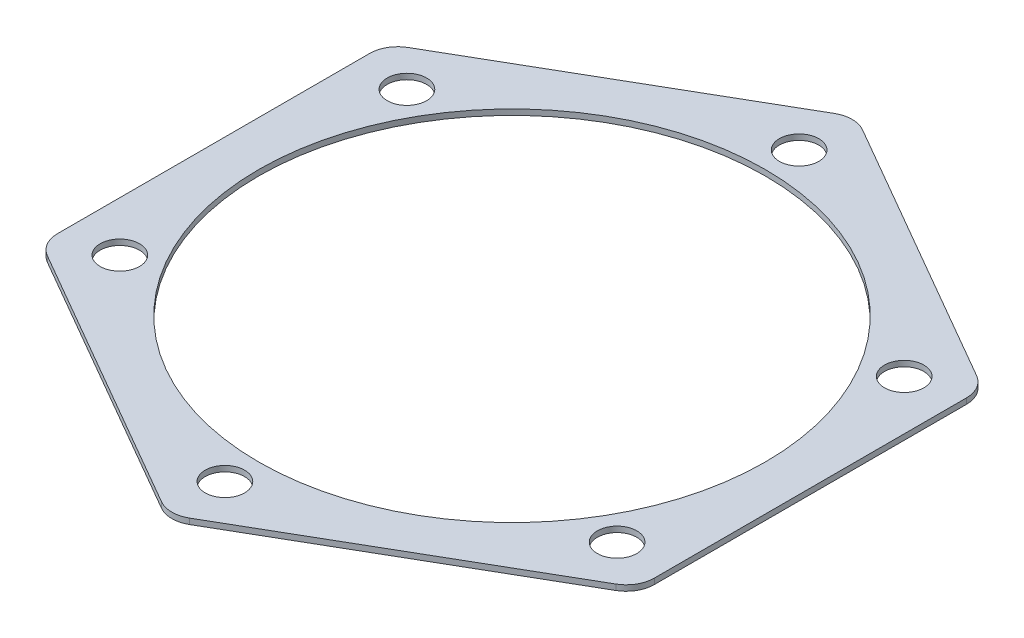
ISO-10303-21;
HEADER;
FILE_DESCRIPTION(('STEP AP214'),'2;1');
FILE_NAME('part.step','',(''),(''),'','','');
FILE_SCHEMA(('AUTOMOTIVE_DESIGN { 1 0 10303 214 1 1 1 1 }'));
ENDSEC;
DATA;
#1=APPLICATION_CONTEXT('core data for automotive mechanical design processes');
#2=APPLICATION_PROTOCOL_DEFINITION('international standard','automotive_design',2000,#1);
#3=PRODUCT_CONTEXT('',#1,'mechanical');
#4=PRODUCT('Part','Part','',(#3));
#5=PRODUCT_RELATED_PRODUCT_CATEGORY('part','',(#4));
#6=PRODUCT_DEFINITION_FORMATION('','',#4);
#7=PRODUCT_DEFINITION_CONTEXT('part definition',#1,'design');
#8=PRODUCT_DEFINITION('design','',#6,#7);
#9=PRODUCT_DEFINITION_SHAPE('','',#8);
#10=(LENGTH_UNIT() NAMED_UNIT(*) SI_UNIT(.MILLI.,.METRE.));
#11=(NAMED_UNIT(*) PLANE_ANGLE_UNIT() SI_UNIT($,.RADIAN.));
#12=(NAMED_UNIT(*) SI_UNIT($,.STERADIAN.) SOLID_ANGLE_UNIT());
#13=UNCERTAINTY_MEASURE_WITH_UNIT(LENGTH_MEASURE(1.E-05),#10,'distance_accuracy_value','');
#14=(GEOMETRIC_REPRESENTATION_CONTEXT(3) GLOBAL_UNCERTAINTY_ASSIGNED_CONTEXT((#13)) GLOBAL_UNIT_ASSIGNED_CONTEXT((#10,
#11,#12)) REPRESENTATION_CONTEXT('',''));
#15=CARTESIAN_POINT('',(0.,0.,0.));
#16=DIRECTION('',(0.,0.,1.));
#17=DIRECTION('',(1.,0.,0.));
#18=AXIS2_PLACEMENT_3D('',#15,#16,#17);
#19=CARTESIAN_POINT('',(3.5120950745773E-13,1.,55.4256258422041));
#20=DIRECTION('',(0.,1.,0.));
#21=DIRECTION('',(0.,0.,1.));
#22=AXIS2_PLACEMENT_3D('',#19,#20,#21);
#23=PLANE('',#22);
#24=CARTESIAN_POINT('',(-44.1672955930031,1.,25.5000000000019));
#25=DIRECTION('',(0.,1.,0.));
#26=DIRECTION('',(0.,0.,1.));
#27=AXIS2_PLACEMENT_3D('',#24,#25,#26);
#28=CIRCLE('',#27,3.50000000000413);
#29=CARTESIAN_POINT('',(-44.1672955930031,1.,29.000000000006));
#30=VERTEX_POINT('',#29);
#31=EDGE_CURVE('E350',#30,#30,#28,.T.);
#32=ORIENTED_EDGE('',*,*,#31,.F.);
#33=EDGE_LOOP('',(#32));
#34=FACE_BOUND('',#33,.T.);
#35=CARTESIAN_POINT('',(44.1672955930096,1.,25.4999999999981));
#36=DIRECTION('',(0.,1.,0.));
#37=DIRECTION('',(0.,0.,1.));
#38=AXIS2_PLACEMENT_3D('',#35,#36,#37);
#39=CIRCLE('',#38,3.50000000000279);
#40=CARTESIAN_POINT('',(44.1672955930096,1.,29.0000000000009));
#41=VERTEX_POINT('',#40);
#42=EDGE_CURVE('E366',#41,#41,#39,.T.);
#43=ORIENTED_EDGE('',*,*,#42,.F.);
#44=EDGE_LOOP('',(#43));
#45=FACE_BOUND('',#44,.T.);
#46=CARTESIAN_POINT('',(0.,1.,-51.));
#47=DIRECTION('',(0.,1.,0.));
#48=DIRECTION('',(0.,0.,1.));
#49=AXIS2_PLACEMENT_3D('',#46,#47,#48);
#50=CIRCLE('',#49,3.5);
#51=CARTESIAN_POINT('',(0.,1.,-47.5));
#52=VERTEX_POINT('',#51);
#53=EDGE_CURVE('E382',#52,#52,#50,.T.);
#54=ORIENTED_EDGE('',*,*,#53,.F.);
#55=EDGE_LOOP('',(#54));
#56=FACE_BOUND('',#55,.T.);
#57=CARTESIAN_POINT('',(3.5120950745773E-13,1.,55.4256258422041));
#58=DIRECTION('',(0.,1.,0.));
#59=DIRECTION('',(0.,0.,1.));
#60=AXIS2_PLACEMENT_3D('',#57,#58,#59);
#61=CIRCLE('',#60,5.);
#62=CARTESIAN_POINT('',(-2.49999999999964,1.,59.7557528611263));
#63=VERTEX_POINT('',#62);
#64=CARTESIAN_POINT('',(2.5000000000004,1.,59.7557528611262));
#65=VERTEX_POINT('',#64);
#66=EDGE_CURVE('E206',#63,#65,#61,.T.);
#67=ORIENTED_EDGE('',*,*,#66,.T.);
#68=DIRECTION('',(0.866025403784435,0.,-0.500000000000006));
#69=VECTOR('',#68,1.);
#70=CARTESIAN_POINT('',(2.5000000000004,1.,59.7557528611262));
#71=LINE('',#70,#69);
#72=CARTESIAN_POINT('',(50.5000000000002,1.,32.0429399400239));
#73=VERTEX_POINT('',#72);
#74=EDGE_CURVE('E118',#65,#73,#71,.T.);
#75=ORIENTED_EDGE('',*,*,#74,.T.);
#76=CARTESIAN_POINT('',(48.0000000000002,1.,27.7128129211017));
#77=DIRECTION('',(0.,1.,0.));
#78=DIRECTION('',(0.,0.,-1.));
#79=AXIS2_PLACEMENT_3D('',#76,#77,#78);
#80=CIRCLE('',#79,5.);
#81=CARTESIAN_POINT('',(53.0000000000002,1.,27.7128129211017));
#82=VERTEX_POINT('',#81);
#83=EDGE_CURVE('E243',#73,#82,#80,.T.);
#84=ORIENTED_EDGE('',*,*,#83,.T.);
#85=DIRECTION('',(0.,0.,-1.));
#86=VECTOR('',#85,1.);
#87=CARTESIAN_POINT('',(53.0000000000002,1.,27.7128129211017));
#88=LINE('',#87,#86);
#89=CARTESIAN_POINT('',(52.9999999999998,1.,-27.7128129211024));
#90=VERTEX_POINT('',#89);
#91=EDGE_CURVE('E263',#82,#90,#88,.T.);
#92=ORIENTED_EDGE('',*,*,#91,.T.);
#93=CARTESIAN_POINT('',(47.9999999999998,1.,-27.7128129211024));
#94=DIRECTION('',(0.,1.,0.));
#95=DIRECTION('',(0.,0.,1.));
#96=AXIS2_PLACEMENT_3D('',#93,#94,#95);
#97=CIRCLE('',#96,5.);
#98=CARTESIAN_POINT('',(50.4999999999998,1.,-32.0429399400246));
#99=VERTEX_POINT('',#98);
#100=EDGE_CURVE('E259',#90,#99,#97,.T.);
#101=ORIENTED_EDGE('',*,*,#100,.T.);
#102=DIRECTION('',(-0.866025403784442,0.,-0.499999999999994));
#103=VECTOR('',#102,1.);
#104=CARTESIAN_POINT('',(50.4999999999998,1.,-32.0429399400246));
#105=LINE('',#104,#103);
#106=CARTESIAN_POINT('',(2.49999999999965,1.,-59.7557528611263));
#107=VERTEX_POINT('',#106);
#108=EDGE_CURVE('E262',#99,#107,#105,.T.);
#109=ORIENTED_EDGE('',*,*,#108,.T.);
#110=CARTESIAN_POINT('',(-3.43559670313786E-13,1.,-55.4256258422041));
#111=DIRECTION('',(0.,1.,0.));
#112=DIRECTION('',(0.,0.,1.));
#113=AXIS2_PLACEMENT_3D('',#110,#111,#112);
#114=CIRCLE('',#113,5.);
#115=CARTESIAN_POINT('',(-2.50000000000039,1.,-59.7557528611263));
#116=VERTEX_POINT('',#115);
#117=EDGE_CURVE('E267',#107,#116,#114,.T.);
#118=ORIENTED_EDGE('',*,*,#117,.T.);
#119=DIRECTION('',(-0.866025403784435,0.,0.500000000000006));
#120=VECTOR('',#119,1.);
#121=CARTESIAN_POINT('',(-2.50000000000039,1.,-59.7557528611263));
#122=LINE('',#121,#120);
#123=CARTESIAN_POINT('',(-50.5000000000002,1.,-32.0429399400239));
#124=VERTEX_POINT('',#123);
#125=EDGE_CURVE('E274',#116,#124,#122,.T.);
#126=ORIENTED_EDGE('',*,*,#125,.T.);
#127=CARTESIAN_POINT('',(-48.0000000000002,1.,-27.7128129211017));
#128=DIRECTION('',(0.,1.,0.));
#129=DIRECTION('',(0.,0.,1.));
#130=AXIS2_PLACEMENT_3D('',#127,#128,#129);
#131=CIRCLE('',#130,5.);
#132=CARTESIAN_POINT('',(-53.0000000000002,1.,-27.7128129211017));
#133=VERTEX_POINT('',#132);
#134=EDGE_CURVE('E149',#124,#133,#131,.T.);
#135=ORIENTED_EDGE('',*,*,#134,.T.);
#136=DIRECTION('',(0.,0.,1.));
#137=VECTOR('',#136,1.);
#138=CARTESIAN_POINT('',(-53.0000000000002,1.,-27.7128129211017));
#139=LINE('',#138,#137);
#140=CARTESIAN_POINT('',(-52.9999999999998,1.,27.7128129211024));
#141=VERTEX_POINT('',#140);
#142=EDGE_CURVE('E143',#133,#141,#139,.T.);
#143=ORIENTED_EDGE('',*,*,#142,.T.);
#144=CARTESIAN_POINT('',(-47.9999999999998,1.,27.7128129211024));
#145=DIRECTION('',(0.,1.,0.));
#146=DIRECTION('',(0.,0.,1.));
#147=AXIS2_PLACEMENT_3D('',#144,#145,#146);
#148=CIRCLE('',#147,5.);
#149=CARTESIAN_POINT('',(-50.4999999999998,1.,32.0429399400246));
#150=VERTEX_POINT('',#149);
#151=EDGE_CURVE('E147',#141,#150,#148,.T.);
#152=ORIENTED_EDGE('',*,*,#151,.T.);
#153=DIRECTION('',(0.866025403784442,0.,0.499999999999994));
#154=VECTOR('',#153,1.);
#155=CARTESIAN_POINT('',(-50.4999999999998,1.,32.0429399400246));
#156=LINE('',#155,#154);
#157=EDGE_CURVE('E63',#150,#63,#156,.T.);
#158=ORIENTED_EDGE('',*,*,#157,.T.);
#159=EDGE_LOOP('',(#67,#75,#84,#92,#101,#109,#118,#126,#135,#143,#152,#158));
#160=FACE_BOUND('',#159,.T.);
#161=CARTESIAN_POINT('',(0.,1.,0.));
#162=DIRECTION('',(0.,1.,0.));
#163=DIRECTION('',(0.,0.,1.));
#164=AXIS2_PLACEMENT_3D('',#161,#162,#163);
#165=CIRCLE('',#164,45.);
#166=CARTESIAN_POINT('',(0.,1.,45.));
#167=VERTEX_POINT('',#166);
#168=EDGE_CURVE('E176',#167,#167,#165,.T.);
#169=ORIENTED_EDGE('',*,*,#168,.F.);
#170=EDGE_LOOP('',(#169));
#171=FACE_BOUND('',#170,.T.);
#172=CARTESIAN_POINT('',(44.1672955930074,1.,-25.5000000000019));
#173=DIRECTION('',(0.,1.,0.));
#174=DIRECTION('',(0.,0.,1.));
#175=AXIS2_PLACEMENT_3D('',#172,#173,#174);
#176=CIRCLE('',#175,3.50000000000063);
#177=CARTESIAN_POINT('',(44.1672955930074,1.,-22.0000000000013));
#178=VERTEX_POINT('',#177);
#179=EDGE_CURVE('E374',#178,#178,#176,.T.);
#180=ORIENTED_EDGE('',*,*,#179,.F.);
#181=EDGE_LOOP('',(#180));
#182=FACE_BOUND('',#181,.T.);
#183=CARTESIAN_POINT('',(4.32978444682486E-12,1.,51.));
#184=DIRECTION('',(0.,1.,0.));
#185=DIRECTION('',(0.,0.,1.));
#186=AXIS2_PLACEMENT_3D('',#183,#184,#185);
#187=CIRCLE('',#186,3.50000000000448);
#188=CARTESIAN_POINT('',(4.32978444682486E-12,1.,54.5000000000045));
#189=VERTEX_POINT('',#188);
#190=EDGE_CURVE('E358',#189,#189,#187,.T.);
#191=ORIENTED_EDGE('',*,*,#190,.F.);
#192=EDGE_LOOP('',(#191));
#193=FACE_BOUND('',#192,.T.);
#194=CARTESIAN_POINT('',(-44.1672955930053,1.,-25.4999999999981));
#195=DIRECTION('',(0.,1.,0.));
#196=DIRECTION('',(0.,0.,1.));
#197=AXIS2_PLACEMENT_3D('',#194,#195,#196);
#198=CIRCLE('',#197,3.50000000000219);
#199=CARTESIAN_POINT('',(-44.1672955930053,1.,-21.9999999999959));
#200=VERTEX_POINT('',#199);
#201=EDGE_CURVE('E339',#200,#200,#198,.T.);
#202=ORIENTED_EDGE('',*,*,#201,.F.);
#203=EDGE_LOOP('',(#202));
#204=FACE_BOUND('',#203,.T.);
#205=ADVANCED_FACE('F45',(#34,#45,#56,#160,#171,#182,#193,#204),#23,.T.);
#206=CARTESIAN_POINT('',(3.5120950745773E-13,0.,55.4256258422041));
#207=DIRECTION('',(0.,1.,0.));
#208=DIRECTION('',(0.,0.,1.));
#209=AXIS2_PLACEMENT_3D('',#206,#207,#208);
#210=PLANE('',#209);
#211=CARTESIAN_POINT('',(3.5120950745773E-13,0.,55.4256258422041));
#212=DIRECTION('',(0.,1.,0.));
#213=DIRECTION('',(0.,0.,1.));
#214=AXIS2_PLACEMENT_3D('',#211,#212,#213);
#215=CIRCLE('',#214,5.);
#216=CARTESIAN_POINT('',(-2.49999999999964,0.,59.7557528611263));
#217=VERTEX_POINT('',#216);
#218=CARTESIAN_POINT('',(2.5000000000004,0.,59.7557528611262));
#219=VERTEX_POINT('',#218);
#220=EDGE_CURVE('E171',#217,#219,#215,.T.);
#221=ORIENTED_EDGE('',*,*,#220,.F.);
#222=DIRECTION('',(0.866025403784442,0.,0.499999999999994));
#223=VECTOR('',#222,1.);
#224=CARTESIAN_POINT('',(-50.4999999999998,0.,32.0429399400246));
#225=LINE('',#224,#223);
#226=CARTESIAN_POINT('',(-50.4999999999998,0.,32.0429399400246));
#227=VERTEX_POINT('',#226);
#228=EDGE_CURVE('E110',#227,#217,#225,.T.);
#229=ORIENTED_EDGE('',*,*,#228,.F.);
#230=CARTESIAN_POINT('',(-47.9999999999998,0.,27.7128129211024));
#231=DIRECTION('',(0.,1.,0.));
#232=DIRECTION('',(0.,0.,1.));
#233=AXIS2_PLACEMENT_3D('',#230,#231,#232);
#234=CIRCLE('',#233,5.);
#235=CARTESIAN_POINT('',(-52.9999999999998,0.,27.7128129211024));
#236=VERTEX_POINT('',#235);
#237=EDGE_CURVE('E104',#236,#227,#234,.T.);
#238=ORIENTED_EDGE('',*,*,#237,.F.);
#239=DIRECTION('',(0.,0.,1.));
#240=VECTOR('',#239,1.);
#241=CARTESIAN_POINT('',(-53.0000000000002,0.,-27.7128129211017));
#242=LINE('',#241,#240);
#243=CARTESIAN_POINT('',(-53.0000000000002,0.,-27.7128129211017));
#244=VERTEX_POINT('',#243);
#245=EDGE_CURVE('E158',#244,#236,#242,.T.);
#246=ORIENTED_EDGE('',*,*,#245,.F.);
#247=CARTESIAN_POINT('',(-48.0000000000002,0.,-27.7128129211017));
#248=DIRECTION('',(0.,1.,0.));
#249=DIRECTION('',(0.,0.,1.));
#250=AXIS2_PLACEMENT_3D('',#247,#248,#249);
#251=CIRCLE('',#250,5.);
#252=CARTESIAN_POINT('',(-50.5000000000002,0.,-32.0429399400239));
#253=VERTEX_POINT('',#252);
#254=EDGE_CURVE('E197',#253,#244,#251,.T.);
#255=ORIENTED_EDGE('',*,*,#254,.F.);
#256=DIRECTION('',(-0.866025403784435,0.,0.500000000000006));
#257=VECTOR('',#256,1.);
#258=CARTESIAN_POINT('',(-2.50000000000039,0.,-59.7557528611263));
#259=LINE('',#258,#257);
#260=CARTESIAN_POINT('',(-2.50000000000039,0.,-59.7557528611263));
#261=VERTEX_POINT('',#260);
#262=EDGE_CURVE('E194',#261,#253,#259,.T.);
#263=ORIENTED_EDGE('',*,*,#262,.F.);
#264=CARTESIAN_POINT('',(-3.43559670313786E-13,0.,-55.4256258422041));
#265=DIRECTION('',(0.,1.,0.));
#266=DIRECTION('',(0.,0.,1.));
#267=AXIS2_PLACEMENT_3D('',#264,#265,#266);
#268=CIRCLE('',#267,5.);
#269=CARTESIAN_POINT('',(2.49999999999965,0.,-59.7557528611263));
#270=VERTEX_POINT('',#269);
#271=EDGE_CURVE('E191',#270,#261,#268,.T.);
#272=ORIENTED_EDGE('',*,*,#271,.F.);
#273=DIRECTION('',(-0.866025403784442,0.,-0.499999999999994));
#274=VECTOR('',#273,1.);
#275=CARTESIAN_POINT('',(50.4999999999998,0.,-32.0429399400246));
#276=LINE('',#275,#274);
#277=CARTESIAN_POINT('',(50.4999999999998,0.,-32.0429399400246));
#278=VERTEX_POINT('',#277);
#279=EDGE_CURVE('E188',#278,#270,#276,.T.);
#280=ORIENTED_EDGE('',*,*,#279,.F.);
#281=CARTESIAN_POINT('',(47.9999999999998,0.,-27.7128129211024));
#282=DIRECTION('',(0.,1.,0.));
#283=DIRECTION('',(0.,0.,1.));
#284=AXIS2_PLACEMENT_3D('',#281,#282,#283);
#285=CIRCLE('',#284,5.);
#286=CARTESIAN_POINT('',(52.9999999999998,0.,-27.7128129211024));
#287=VERTEX_POINT('',#286);
#288=EDGE_CURVE('E185',#287,#278,#285,.T.);
#289=ORIENTED_EDGE('',*,*,#288,.F.);
#290=DIRECTION('',(0.,0.,-1.));
#291=VECTOR('',#290,1.);
#292=CARTESIAN_POINT('',(53.0000000000002,0.,27.7128129211017));
#293=LINE('',#292,#291);
#294=CARTESIAN_POINT('',(53.0000000000002,0.,27.7128129211017));
#295=VERTEX_POINT('',#294);
#296=EDGE_CURVE('E182',#295,#287,#293,.T.);
#297=ORIENTED_EDGE('',*,*,#296,.F.);
#298=CARTESIAN_POINT('',(48.0000000000002,0.,27.7128129211017));
#299=DIRECTION('',(0.,1.,0.));
#300=DIRECTION('',(0.,0.,-1.));
#301=AXIS2_PLACEMENT_3D('',#298,#299,#300);
#302=CIRCLE('',#301,5.);
#303=CARTESIAN_POINT('',(50.5000000000002,0.,32.0429399400239));
#304=VERTEX_POINT('',#303);
#305=EDGE_CURVE('E179',#304,#295,#302,.T.);
#306=ORIENTED_EDGE('',*,*,#305,.F.);
#307=DIRECTION('',(0.866025403784435,0.,-0.500000000000006));
#308=VECTOR('',#307,1.);
#309=CARTESIAN_POINT('',(2.5000000000004,0.,59.7557528611262));
#310=LINE('',#309,#308);
#311=EDGE_CURVE('E175',#219,#304,#310,.T.);
#312=ORIENTED_EDGE('',*,*,#311,.F.);
#313=EDGE_LOOP('',(#221,#229,#238,#246,#255,#263,#272,#280,#289,#297,#306,#312));
#314=FACE_BOUND('',#313,.T.);
#315=CARTESIAN_POINT('',(0.,0.,0.));
#316=DIRECTION('',(0.,1.,0.));
#317=DIRECTION('',(0.,0.,1.));
#318=AXIS2_PLACEMENT_3D('',#315,#316,#317);
#319=CIRCLE('',#318,45.);
#320=CARTESIAN_POINT('',(0.,0.,45.));
#321=VERTEX_POINT('',#320);
#322=EDGE_CURVE('E386',#321,#321,#319,.T.);
#323=ORIENTED_EDGE('',*,*,#322,.T.);
#324=EDGE_LOOP('',(#323));
#325=FACE_BOUND('',#324,.T.);
#326=CARTESIAN_POINT('',(0.,0.,-51.));
#327=DIRECTION('',(0.,1.,0.));
#328=DIRECTION('',(0.,0.,1.));
#329=AXIS2_PLACEMENT_3D('',#326,#327,#328);
#330=CIRCLE('',#329,3.5);
#331=CARTESIAN_POINT('',(0.,0.,-47.5));
#332=VERTEX_POINT('',#331);
#333=EDGE_CURVE('E378',#332,#332,#330,.T.);
#334=ORIENTED_EDGE('',*,*,#333,.T.);
#335=EDGE_LOOP('',(#334));
#336=FACE_BOUND('',#335,.T.);
#337=CARTESIAN_POINT('',(44.1672955930074,0.,-25.5000000000019));
#338=DIRECTION('',(0.,1.,0.));
#339=DIRECTION('',(0.,0.,1.));
#340=AXIS2_PLACEMENT_3D('',#337,#338,#339);
#341=CIRCLE('',#340,3.50000000000063);
#342=CARTESIAN_POINT('',(44.1672955930074,0.,-22.0000000000013));
#343=VERTEX_POINT('',#342);
#344=EDGE_CURVE('E370',#343,#343,#341,.T.);
#345=ORIENTED_EDGE('',*,*,#344,.T.);
#346=EDGE_LOOP('',(#345));
#347=FACE_BOUND('',#346,.T.);
#348=CARTESIAN_POINT('',(44.1672955930096,0.,25.4999999999981));
#349=DIRECTION('',(0.,1.,0.));
#350=DIRECTION('',(0.,0.,1.));
#351=AXIS2_PLACEMENT_3D('',#348,#349,#350);
#352=CIRCLE('',#351,3.50000000000279);
#353=CARTESIAN_POINT('',(44.1672955930096,0.,29.0000000000009));
#354=VERTEX_POINT('',#353);
#355=EDGE_CURVE('E362',#354,#354,#352,.T.);
#356=ORIENTED_EDGE('',*,*,#355,.T.);
#357=EDGE_LOOP('',(#356));
#358=FACE_BOUND('',#357,.T.);
#359=CARTESIAN_POINT('',(4.32978444682486E-12,0.,51.));
#360=DIRECTION('',(0.,1.,0.));
#361=DIRECTION('',(0.,0.,1.));
#362=AXIS2_PLACEMENT_3D('',#359,#360,#361);
#363=CIRCLE('',#362,3.50000000000448);
#364=CARTESIAN_POINT('',(4.32978444682486E-12,0.,54.5000000000045));
#365=VERTEX_POINT('',#364);
#366=EDGE_CURVE('E354',#365,#365,#363,.T.);
#367=ORIENTED_EDGE('',*,*,#366,.T.);
#368=EDGE_LOOP('',(#367));
#369=FACE_BOUND('',#368,.T.);
#370=CARTESIAN_POINT('',(-44.1672955930031,0.,25.5000000000019));
#371=DIRECTION('',(0.,1.,0.));
#372=DIRECTION('',(0.,0.,1.));
#373=AXIS2_PLACEMENT_3D('',#370,#371,#372);
#374=CIRCLE('',#373,3.50000000000413);
#375=CARTESIAN_POINT('',(-44.1672955930031,0.,29.000000000006));
#376=VERTEX_POINT('',#375);
#377=EDGE_CURVE('E347',#376,#376,#374,.T.);
#378=ORIENTED_EDGE('',*,*,#377,.T.);
#379=EDGE_LOOP('',(#378));
#380=FACE_BOUND('',#379,.T.);
#381=CARTESIAN_POINT('',(-44.1672955930053,0.,-25.4999999999981));
#382=DIRECTION('',(0.,1.,0.));
#383=DIRECTION('',(0.,0.,1.));
#384=AXIS2_PLACEMENT_3D('',#381,#382,#383);
#385=CIRCLE('',#384,3.50000000000219);
#386=CARTESIAN_POINT('',(-44.1672955930053,0.,-21.9999999999959));
#387=VERTEX_POINT('',#386);
#388=EDGE_CURVE('E342',#387,#387,#385,.T.);
#389=ORIENTED_EDGE('',*,*,#388,.T.);
#390=EDGE_LOOP('',(#389));
#391=FACE_BOUND('',#390,.T.);
#392=ADVANCED_FACE('F247',(#314,#325,#336,#347,#358,#369,#380,#391),#210,.F.);
#393=CARTESIAN_POINT('',(3.5120950745773E-13,1.,55.4256258422041));
#394=DIRECTION('',(0.,-1.,0.));
#395=DIRECTION('',(0.,0.,-1.));
#396=AXIS2_PLACEMENT_3D('',#393,#394,#395);
#397=CYLINDRICAL_SURFACE('',#396,5.);
#398=ORIENTED_EDGE('',*,*,#220,.T.);
#399=DIRECTION('',(0.,-1.,0.));
#400=VECTOR('',#399,1.);
#401=CARTESIAN_POINT('',(2.5000000000004,1.,59.7557528611262));
#402=LINE('',#401,#400);
#403=EDGE_CURVE('E11',#65,#219,#402,.T.);
#404=ORIENTED_EDGE('',*,*,#403,.F.);
#405=ORIENTED_EDGE('',*,*,#66,.F.);
#406=DIRECTION('',(0.,-1.,0.));
#407=VECTOR('',#406,1.);
#408=CARTESIAN_POINT('',(-2.49999999999964,1.,59.7557528611263));
#409=LINE('',#408,#407);
#410=EDGE_CURVE('E167',#63,#217,#409,.T.);
#411=ORIENTED_EDGE('',*,*,#410,.T.);
#412=EDGE_LOOP('',(#398,#404,#405,#411));
#413=FACE_BOUND('',#412,.T.);
#414=ADVANCED_FACE('F47',(#413),#397,.T.);
#415=CARTESIAN_POINT('',(2.5000000000004,1.,59.7557528611262));
#416=DIRECTION('',(-0.500000000000006,0.,-0.866025403784435));
#417=DIRECTION('',(-0.866025403784435,0.,0.500000000000006));
#418=AXIS2_PLACEMENT_3D('',#415,#416,#417);
#419=PLANE('',#418);
#420=ORIENTED_EDGE('',*,*,#311,.T.);
#421=DIRECTION('',(0.,-1.,0.));
#422=VECTOR('',#421,1.);
#423=CARTESIAN_POINT('',(50.5000000000002,1.,32.0429399400239));
#424=LINE('',#423,#422);
#425=EDGE_CURVE('E55',#73,#304,#424,.T.);
#426=ORIENTED_EDGE('',*,*,#425,.F.);
#427=ORIENTED_EDGE('',*,*,#74,.F.);
#428=ORIENTED_EDGE('',*,*,#403,.T.);
#429=EDGE_LOOP('',(#420,#426,#427,#428));
#430=FACE_BOUND('',#429,.T.);
#431=ADVANCED_FACE('F539',(#430),#419,.F.);
#432=CARTESIAN_POINT('',(48.0000000000002,1.,27.7128129211017));
#433=DIRECTION('',(0.,-1.,0.));
#434=DIRECTION('',(0.,0.,-1.));
#435=AXIS2_PLACEMENT_3D('',#432,#433,#434);
#436=CYLINDRICAL_SURFACE('',#435,5.);
#437=ORIENTED_EDGE('',*,*,#305,.T.);
#438=DIRECTION('',(0.,-1.,0.));
#439=VECTOR('',#438,1.);
#440=CARTESIAN_POINT('',(53.0000000000002,1.,27.7128129211017));
#441=LINE('',#440,#439);
#442=EDGE_CURVE('E233',#82,#295,#441,.T.);
#443=ORIENTED_EDGE('',*,*,#442,.F.);
#444=ORIENTED_EDGE('',*,*,#83,.F.);
#445=ORIENTED_EDGE('',*,*,#425,.T.);
#446=EDGE_LOOP('',(#437,#443,#444,#445));
#447=FACE_BOUND('',#446,.T.);
#448=ADVANCED_FACE('F241',(#447),#436,.T.);
#449=CARTESIAN_POINT('',(53.0000000000002,1.,27.7128129211017));
#450=DIRECTION('',(-1.,0.,0.));
#451=DIRECTION('',(0.,0.,1.));
#452=AXIS2_PLACEMENT_3D('',#449,#450,#451);
#453=PLANE('',#452);
#454=ORIENTED_EDGE('',*,*,#296,.T.);
#455=DIRECTION('',(0.,-1.,0.));
#456=VECTOR('',#455,1.);
#457=CARTESIAN_POINT('',(52.9999999999998,1.,-27.7128129211024));
#458=LINE('',#457,#456);
#459=EDGE_CURVE('E229',#90,#287,#458,.T.);
#460=ORIENTED_EDGE('',*,*,#459,.F.);
#461=ORIENTED_EDGE('',*,*,#91,.F.);
#462=ORIENTED_EDGE('',*,*,#442,.T.);
#463=EDGE_LOOP('',(#454,#460,#461,#462));
#464=FACE_BOUND('',#463,.T.);
#465=ADVANCED_FACE('F253',(#464),#453,.F.);
#466=CARTESIAN_POINT('',(47.9999999999998,1.,-27.7128129211024));
#467=DIRECTION('',(0.,-1.,0.));
#468=DIRECTION('',(0.,0.,-1.));
#469=AXIS2_PLACEMENT_3D('',#466,#467,#468);
#470=CYLINDRICAL_SURFACE('',#469,5.);
#471=ORIENTED_EDGE('',*,*,#288,.T.);
#472=DIRECTION('',(0.,-1.,0.));
#473=VECTOR('',#472,1.);
#474=CARTESIAN_POINT('',(50.4999999999998,1.,-32.0429399400246));
#475=LINE('',#474,#473);
#476=EDGE_CURVE('E225',#99,#278,#475,.T.);
#477=ORIENTED_EDGE('',*,*,#476,.F.);
#478=ORIENTED_EDGE('',*,*,#100,.F.);
#479=ORIENTED_EDGE('',*,*,#459,.T.);
#480=EDGE_LOOP('',(#471,#477,#478,#479));
#481=FACE_BOUND('',#480,.T.);
#482=ADVANCED_FACE('F257',(#481),#470,.T.);
#483=CARTESIAN_POINT('',(50.4999999999998,1.,-32.0429399400246));
#484=DIRECTION('',(-0.499999999999995,0.,0.866025403784442));
#485=DIRECTION('',(0.866025403784442,0.,0.499999999999995));
#486=AXIS2_PLACEMENT_3D('',#483,#484,#485);
#487=PLANE('',#486);
#488=ORIENTED_EDGE('',*,*,#279,.T.);
#489=DIRECTION('',(0.,-1.,0.));
#490=VECTOR('',#489,1.);
#491=CARTESIAN_POINT('',(2.49999999999965,1.,-59.7557528611263));
#492=LINE('',#491,#490);
#493=EDGE_CURVE('E221',#107,#270,#492,.T.);
#494=ORIENTED_EDGE('',*,*,#493,.F.);
#495=ORIENTED_EDGE('',*,*,#108,.F.);
#496=ORIENTED_EDGE('',*,*,#476,.T.);
#497=EDGE_LOOP('',(#488,#494,#495,#496));
#498=FACE_BOUND('',#497,.T.);
#499=ADVANCED_FACE('F500',(#498),#487,.F.);
#500=CARTESIAN_POINT('',(-3.43559670313786E-13,1.,-55.4256258422041));
#501=DIRECTION('',(0.,-1.,0.));
#502=DIRECTION('',(0.,0.,-1.));
#503=AXIS2_PLACEMENT_3D('',#500,#501,#502);
#504=CYLINDRICAL_SURFACE('',#503,5.);
#505=ORIENTED_EDGE('',*,*,#271,.T.);
#506=DIRECTION('',(0.,-1.,0.));
#507=VECTOR('',#506,1.);
#508=CARTESIAN_POINT('',(-2.50000000000039,1.,-59.7557528611263));
#509=LINE('',#508,#507);
#510=EDGE_CURVE('E217',#116,#261,#509,.T.);
#511=ORIENTED_EDGE('',*,*,#510,.F.);
#512=ORIENTED_EDGE('',*,*,#117,.F.);
#513=ORIENTED_EDGE('',*,*,#493,.T.);
#514=EDGE_LOOP('',(#505,#511,#512,#513));
#515=FACE_BOUND('',#514,.T.);
#516=ADVANCED_FACE('F490',(#515),#504,.T.);
#517=CARTESIAN_POINT('',(-2.50000000000039,1.,-59.7557528611263));
#518=DIRECTION('',(0.500000000000006,0.,0.866025403784435));
#519=DIRECTION('',(0.866025403784435,0.,-0.500000000000006));
#520=AXIS2_PLACEMENT_3D('',#517,#518,#519);
#521=PLANE('',#520);
#522=ORIENTED_EDGE('',*,*,#262,.T.);
#523=DIRECTION('',(0.,-1.,0.));
#524=VECTOR('',#523,1.);
#525=CARTESIAN_POINT('',(-50.5000000000002,1.,-32.0429399400239));
#526=LINE('',#525,#524);
#527=EDGE_CURVE('E213',#124,#253,#526,.T.);
#528=ORIENTED_EDGE('',*,*,#527,.F.);
#529=ORIENTED_EDGE('',*,*,#125,.F.);
#530=ORIENTED_EDGE('',*,*,#510,.T.);
#531=EDGE_LOOP('',(#522,#528,#529,#530));
#532=FACE_BOUND('',#531,.T.);
#533=ADVANCED_FACE('F282',(#532),#521,.F.);
#534=CARTESIAN_POINT('',(-48.0000000000002,1.,-27.7128129211017));
#535=DIRECTION('',(0.,-1.,0.));
#536=DIRECTION('',(0.,0.,-1.));
#537=AXIS2_PLACEMENT_3D('',#534,#535,#536);
#538=CYLINDRICAL_SURFACE('',#537,5.);
#539=ORIENTED_EDGE('',*,*,#254,.T.);
#540=DIRECTION('',(0.,-1.,0.));
#541=VECTOR('',#540,1.);
#542=CARTESIAN_POINT('',(-53.0000000000002,1.,-27.7128129211017));
#543=LINE('',#542,#541);
#544=EDGE_CURVE('E160',#133,#244,#543,.T.);
#545=ORIENTED_EDGE('',*,*,#544,.F.);
#546=ORIENTED_EDGE('',*,*,#134,.F.);
#547=ORIENTED_EDGE('',*,*,#527,.T.);
#548=EDGE_LOOP('',(#539,#545,#546,#547));
#549=FACE_BOUND('',#548,.T.);
#550=ADVANCED_FACE('F286',(#549),#538,.T.);
#551=CARTESIAN_POINT('',(-53.0000000000002,1.,-27.7128129211017));
#552=DIRECTION('',(1.,0.,0.));
#553=DIRECTION('',(0.,0.,-1.));
#554=AXIS2_PLACEMENT_3D('',#551,#552,#553);
#555=PLANE('',#554);
#556=ORIENTED_EDGE('',*,*,#245,.T.);
#557=DIRECTION('',(0.,-1.,0.));
#558=VECTOR('',#557,1.);
#559=CARTESIAN_POINT('',(-52.9999999999998,1.,27.7128129211024));
#560=LINE('',#559,#558);
#561=EDGE_CURVE('E155',#141,#236,#560,.T.);
#562=ORIENTED_EDGE('',*,*,#561,.F.);
#563=ORIENTED_EDGE('',*,*,#142,.F.);
#564=ORIENTED_EDGE('',*,*,#544,.T.);
#565=EDGE_LOOP('',(#556,#562,#563,#564));
#566=FACE_BOUND('',#565,.T.);
#567=ADVANCED_FACE('F156',(#566),#555,.F.);
#568=CARTESIAN_POINT('',(-47.9999999999998,1.,27.7128129211024));
#569=DIRECTION('',(0.,-1.,0.));
#570=DIRECTION('',(0.,0.,-1.));
#571=AXIS2_PLACEMENT_3D('',#568,#569,#570);
#572=CYLINDRICAL_SURFACE('',#571,5.);
#573=ORIENTED_EDGE('',*,*,#237,.T.);
#574=DIRECTION('',(0.,-1.,0.));
#575=VECTOR('',#574,1.);
#576=CARTESIAN_POINT('',(-50.4999999999998,1.,32.0429399400246));
#577=LINE('',#576,#575);
#578=EDGE_CURVE('E161',#150,#227,#577,.T.);
#579=ORIENTED_EDGE('',*,*,#578,.F.);
#580=ORIENTED_EDGE('',*,*,#151,.F.);
#581=ORIENTED_EDGE('',*,*,#561,.T.);
#582=EDGE_LOOP('',(#573,#579,#580,#581));
#583=FACE_BOUND('',#582,.T.);
#584=ADVANCED_FACE('F163',(#583),#572,.T.);
#585=CARTESIAN_POINT('',(-50.4999999999998,1.,32.0429399400246));
#586=DIRECTION('',(0.499999999999995,0.,-0.866025403784442));
#587=DIRECTION('',(-0.866025403784442,0.,-0.499999999999995));
#588=AXIS2_PLACEMENT_3D('',#585,#586,#587);
#589=PLANE('',#588);
#590=ORIENTED_EDGE('',*,*,#228,.T.);
#591=ORIENTED_EDGE('',*,*,#410,.F.);
#592=ORIENTED_EDGE('',*,*,#157,.F.);
#593=ORIENTED_EDGE('',*,*,#578,.T.);
#594=EDGE_LOOP('',(#590,#591,#592,#593));
#595=FACE_BOUND('',#594,.T.);
#596=ADVANCED_FACE('F290',(#595),#589,.F.);
#597=CARTESIAN_POINT('',(0.,1.,0.));
#598=DIRECTION('',(0.,-1.,0.));
#599=DIRECTION('',(0.,0.,-1.));
#600=AXIS2_PLACEMENT_3D('',#597,#598,#599);
#601=CYLINDRICAL_SURFACE('',#600,45.);
#602=ORIENTED_EDGE('',*,*,#168,.T.);
#603=EDGE_LOOP('',(#602));
#604=FACE_BOUND('',#603,.T.);
#605=ORIENTED_EDGE('',*,*,#322,.F.);
#606=EDGE_LOOP('',(#605));
#607=FACE_BOUND('',#606,.T.);
#608=ADVANCED_FACE('F292',(#604,#607),#601,.F.);
#609=CARTESIAN_POINT('',(0.,1.,-51.));
#610=DIRECTION('',(0.,-1.,0.));
#611=DIRECTION('',(0.,0.,-1.));
#612=AXIS2_PLACEMENT_3D('',#609,#610,#611);
#613=CYLINDRICAL_SURFACE('',#612,3.5);
#614=ORIENTED_EDGE('',*,*,#53,.T.);
#615=EDGE_LOOP('',(#614));
#616=FACE_BOUND('',#615,.T.);
#617=ORIENTED_EDGE('',*,*,#333,.F.);
#618=EDGE_LOOP('',(#617));
#619=FACE_BOUND('',#618,.T.);
#620=ADVANCED_FACE('F298',(#616,#619),#613,.F.);
#621=CARTESIAN_POINT('',(44.1672955930074,1.,-25.5000000000019));
#622=DIRECTION('',(0.,-1.,0.));
#623=DIRECTION('',(0.,0.,-1.));
#624=AXIS2_PLACEMENT_3D('',#621,#622,#623);
#625=CYLINDRICAL_SURFACE('',#624,3.50000000000063);
#626=ORIENTED_EDGE('',*,*,#179,.T.);
#627=EDGE_LOOP('',(#626));
#628=FACE_BOUND('',#627,.T.);
#629=ORIENTED_EDGE('',*,*,#344,.F.);
#630=EDGE_LOOP('',(#629));
#631=FACE_BOUND('',#630,.T.);
#632=ADVANCED_FACE('F314',(#628,#631),#625,.F.);
#633=CARTESIAN_POINT('',(44.1672955930096,1.,25.4999999999981));
#634=DIRECTION('',(0.,-1.,0.));
#635=DIRECTION('',(0.,0.,-1.));
#636=AXIS2_PLACEMENT_3D('',#633,#634,#635);
#637=CYLINDRICAL_SURFACE('',#636,3.50000000000279);
#638=ORIENTED_EDGE('',*,*,#42,.T.);
#639=EDGE_LOOP('',(#638));
#640=FACE_BOUND('',#639,.T.);
#641=ORIENTED_EDGE('',*,*,#355,.F.);
#642=EDGE_LOOP('',(#641));
#643=FACE_BOUND('',#642,.T.);
#644=ADVANCED_FACE('F318',(#640,#643),#637,.F.);
#645=CARTESIAN_POINT('',(4.32978444682486E-12,1.,51.));
#646=DIRECTION('',(0.,-1.,0.));
#647=DIRECTION('',(0.,0.,-1.));
#648=AXIS2_PLACEMENT_3D('',#645,#646,#647);
#649=CYLINDRICAL_SURFACE('',#648,3.50000000000448);
#650=ORIENTED_EDGE('',*,*,#190,.T.);
#651=EDGE_LOOP('',(#650));
#652=FACE_BOUND('',#651,.T.);
#653=ORIENTED_EDGE('',*,*,#366,.F.);
#654=EDGE_LOOP('',(#653));
#655=FACE_BOUND('',#654,.T.);
#656=ADVANCED_FACE('F322',(#652,#655),#649,.F.);
#657=CARTESIAN_POINT('',(-44.1672955930031,1.,25.5000000000019));
#658=DIRECTION('',(0.,-1.,0.));
#659=DIRECTION('',(0.,0.,-1.));
#660=AXIS2_PLACEMENT_3D('',#657,#658,#659);
#661=CYLINDRICAL_SURFACE('',#660,3.50000000000413);
#662=ORIENTED_EDGE('',*,*,#31,.T.);
#663=EDGE_LOOP('',(#662));
#664=FACE_BOUND('',#663,.T.);
#665=ORIENTED_EDGE('',*,*,#377,.F.);
#666=EDGE_LOOP('',(#665));
#667=FACE_BOUND('',#666,.T.);
#668=ADVANCED_FACE('F326',(#664,#667),#661,.F.);
#669=CARTESIAN_POINT('',(-44.1672955930053,1.,-25.4999999999981));
#670=DIRECTION('',(0.,-1.,0.));
#671=DIRECTION('',(0.,0.,-1.));
#672=AXIS2_PLACEMENT_3D('',#669,#670,#671);
#673=CYLINDRICAL_SURFACE('',#672,3.50000000000219);
#674=ORIENTED_EDGE('',*,*,#201,.T.);
#675=EDGE_LOOP('',(#674));
#676=FACE_BOUND('',#675,.T.);
#677=ORIENTED_EDGE('',*,*,#388,.F.);
#678=EDGE_LOOP('',(#677));
#679=FACE_BOUND('',#678,.T.);
#680=ADVANCED_FACE('F330',(#676,#679),#673,.F.);
#681=CLOSED_SHELL('',(#205,#392,#414,#431,#448,#465,#482,#499,#516,#533,#550,#567,#584,#596,
#608,#620,#632,#644,#656,#668,#680));
#682=MANIFOLD_SOLID_BREP('B2',#681);
#683=ADVANCED_BREP_SHAPE_REPRESENTATION('',(#18,#682),#14);
#684=SHAPE_DEFINITION_REPRESENTATION(#9,#683);
ENDSEC;
END-ISO-10303-21;
